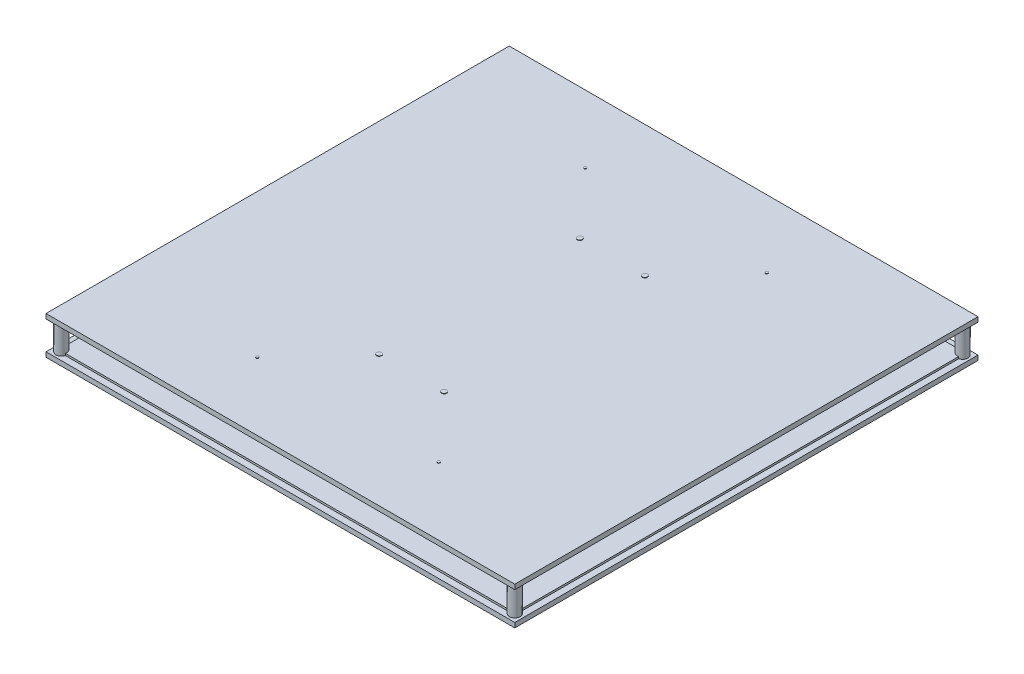
ISO-10303-21;
HEADER;
FILE_DESCRIPTION(('STEP AP214'),'2;1');
FILE_NAME('part.step','',(''),(''),'','','');
FILE_SCHEMA(('AUTOMOTIVE_DESIGN { 1 0 10303 214 1 1 1 1 }'));
ENDSEC;
DATA;
#1=APPLICATION_CONTEXT('core data for automotive mechanical design processes');
#2=APPLICATION_PROTOCOL_DEFINITION('international standard','automotive_design',2000,#1);
#3=PRODUCT_CONTEXT('',#1,'mechanical');
#4=PRODUCT('Part','Part','',(#3));
#5=PRODUCT_RELATED_PRODUCT_CATEGORY('part','',(#4));
#6=PRODUCT_DEFINITION_FORMATION('','',#4);
#7=PRODUCT_DEFINITION_CONTEXT('part definition',#1,'design');
#8=PRODUCT_DEFINITION('design','',#6,#7);
#9=PRODUCT_DEFINITION_SHAPE('','',#8);
#10=(LENGTH_UNIT() NAMED_UNIT(*) SI_UNIT(.MILLI.,.METRE.));
#11=(NAMED_UNIT(*) PLANE_ANGLE_UNIT() SI_UNIT($,.RADIAN.));
#12=(NAMED_UNIT(*) SI_UNIT($,.STERADIAN.) SOLID_ANGLE_UNIT());
#13=UNCERTAINTY_MEASURE_WITH_UNIT(LENGTH_MEASURE(1.E-05),#10,'distance_accuracy_value','');
#14=(GEOMETRIC_REPRESENTATION_CONTEXT(3) GLOBAL_UNCERTAINTY_ASSIGNED_CONTEXT((#13)) GLOBAL_UNIT_ASSIGNED_CONTEXT((#10,
#11,#12)) REPRESENTATION_CONTEXT('',''));
#15=CARTESIAN_POINT('',(0.,0.,0.));
#16=DIRECTION('',(0.,0.,1.));
#17=DIRECTION('',(1.,0.,0.));
#18=AXIS2_PLACEMENT_3D('',#15,#16,#17);
#19=CARTESIAN_POINT('',(151.154277778757,4.445,149.310271544904));
#20=DIRECTION('',(0.,0.,1.));
#21=DIRECTION('',(1.,0.,0.));
#22=AXIS2_PLACEMENT_3D('',#19,#20,#21);
#23=PLANE('',#22);
#24=DIRECTION('',(0.,-1.,0.));
#25=VECTOR('',#24,1.);
#26=CARTESIAN_POINT('',(-146.860277327342,23.876,149.310271544904));
#27=LINE('',#26,#25);
#28=CARTESIAN_POINT('',(-146.860277327342,3.175,149.310271544904));
#29=VERTEX_POINT('',#28);
#30=CARTESIAN_POINT('',(-146.860277327342,4.445,149.310271544904));
#31=VERTEX_POINT('',#30);
#32=EDGE_CURVE('E65',#29,#31,#27,.F.);
#33=ORIENTED_EDGE('',*,*,#32,.F.);
#34=DIRECTION('',(-1.,0.,0.));
#35=VECTOR('',#34,1.);
#36=CARTESIAN_POINT('',(151.154277778757,3.175,149.310271544904));
#37=LINE('',#36,#35);
#38=CARTESIAN_POINT('',(146.860277327342,3.175,149.310271544904));
#39=VERTEX_POINT('',#38);
#40=EDGE_CURVE('E320',#39,#29,#37,.T.);
#41=ORIENTED_EDGE('',*,*,#40,.F.);
#42=DIRECTION('',(0.,-1.,0.));
#43=VECTOR('',#42,1.);
#44=CARTESIAN_POINT('',(146.860277327342,23.876,149.310271544904));
#45=LINE('',#44,#43);
#46=CARTESIAN_POINT('',(146.860277327342,4.445,149.310271544904));
#47=VERTEX_POINT('',#46);
#48=EDGE_CURVE('E190',#39,#47,#45,.F.);
#49=ORIENTED_EDGE('',*,*,#48,.T.);
#50=DIRECTION('',(-1.,0.,0.));
#51=VECTOR('',#50,1.);
#52=CARTESIAN_POINT('',(151.154277778757,4.445,149.310271544904));
#53=LINE('',#52,#51);
#54=EDGE_CURVE('E169',#47,#31,#53,.T.);
#55=ORIENTED_EDGE('',*,*,#54,.T.);
#56=EDGE_LOOP('',(#33,#41,#49,#55));
#57=FACE_BOUND('',#56,.T.);
#58=ADVANCED_FACE('F42',(#57),#23,.T.);
#59=CARTESIAN_POINT('',(151.154277778757,4.445,-149.310271544904));
#60=DIRECTION('',(1.,0.,0.));
#61=DIRECTION('',(0.,0.,-1.));
#62=AXIS2_PLACEMENT_3D('',#59,#60,#61);
#63=PLANE('',#62);
#64=DIRECTION('',(0.,0.,1.));
#65=VECTOR('',#64,1.);
#66=CARTESIAN_POINT('',(151.154277778757,4.445,-149.310271544904));
#67=LINE('',#66,#65);
#68=CARTESIAN_POINT('',(151.154277778757,4.445,-145.016271093489));
#69=VERTEX_POINT('',#68);
#70=CARTESIAN_POINT('',(151.154277778757,4.445,145.016271093489));
#71=VERTEX_POINT('',#70);
#72=EDGE_CURVE('E324',#69,#71,#67,.T.);
#73=ORIENTED_EDGE('',*,*,#72,.T.);
#74=DIRECTION('',(0.,-1.,0.));
#75=VECTOR('',#74,1.);
#76=CARTESIAN_POINT('',(151.154277778757,23.876,145.016271093489));
#77=LINE('',#76,#75);
#78=CARTESIAN_POINT('',(151.154277778757,3.175,145.016271093489));
#79=VERTEX_POINT('',#78);
#80=EDGE_CURVE('E187',#71,#79,#77,.T.);
#81=ORIENTED_EDGE('',*,*,#80,.T.);
#82=DIRECTION('',(0.,0.,1.));
#83=VECTOR('',#82,1.);
#84=CARTESIAN_POINT('',(151.154277778757,3.175,-149.310271544904));
#85=LINE('',#84,#83);
#86=CARTESIAN_POINT('',(151.154277778757,3.175,-145.016271093489));
#87=VERTEX_POINT('',#86);
#88=EDGE_CURVE('E321',#87,#79,#85,.T.);
#89=ORIENTED_EDGE('',*,*,#88,.F.);
#90=DIRECTION('',(0.,-1.,0.));
#91=VECTOR('',#90,1.);
#92=CARTESIAN_POINT('',(151.154277778757,23.876,-145.016271093489));
#93=LINE('',#92,#91);
#94=EDGE_CURVE('E199',#69,#87,#93,.T.);
#95=ORIENTED_EDGE('',*,*,#94,.F.);
#96=EDGE_LOOP('',(#73,#81,#89,#95));
#97=FACE_BOUND('',#96,.T.);
#98=ADVANCED_FACE('F387',(#97),#63,.T.);
#99=CARTESIAN_POINT('',(151.154277778757,4.445,-149.310271544904));
#100=DIRECTION('',(0.,0.,1.));
#101=DIRECTION('',(1.,0.,0.));
#102=AXIS2_PLACEMENT_3D('',#99,#100,#101);
#103=PLANE('',#102);
#104=DIRECTION('',(-1.,0.,0.));
#105=VECTOR('',#104,1.);
#106=CARTESIAN_POINT('',(151.154277778757,4.445,-149.310271544904));
#107=LINE('',#106,#105);
#108=CARTESIAN_POINT('',(146.860277327342,4.445,-149.310271544904));
#109=VERTEX_POINT('',#108);
#110=CARTESIAN_POINT('',(-146.860277327342,4.445,-149.310271544904));
#111=VERTEX_POINT('',#110);
#112=EDGE_CURVE('E168',#109,#111,#107,.T.);
#113=ORIENTED_EDGE('',*,*,#112,.F.);
#114=DIRECTION('',(0.,-1.,0.));
#115=VECTOR('',#114,1.);
#116=CARTESIAN_POINT('',(146.860277327342,23.876,-149.310271544904));
#117=LINE('',#116,#115);
#118=CARTESIAN_POINT('',(146.860277327342,3.175,-149.310271544904));
#119=VERTEX_POINT('',#118);
#120=EDGE_CURVE('E205',#109,#119,#117,.T.);
#121=ORIENTED_EDGE('',*,*,#120,.T.);
#122=DIRECTION('',(-1.,0.,0.));
#123=VECTOR('',#122,1.);
#124=CARTESIAN_POINT('',(151.154277778757,3.175,-149.310271544904));
#125=LINE('',#124,#123);
#126=CARTESIAN_POINT('',(-146.860277327342,3.175,-149.310271544904));
#127=VERTEX_POINT('',#126);
#128=EDGE_CURVE('E330',#119,#127,#125,.T.);
#129=ORIENTED_EDGE('',*,*,#128,.T.);
#130=DIRECTION('',(0.,-1.,0.));
#131=VECTOR('',#130,1.);
#132=CARTESIAN_POINT('',(-146.860277327342,23.876,-149.310271544904));
#133=LINE('',#132,#131);
#134=EDGE_CURVE('E314',#111,#127,#133,.T.);
#135=ORIENTED_EDGE('',*,*,#134,.F.);
#136=EDGE_LOOP('',(#113,#121,#129,#135));
#137=FACE_BOUND('',#136,.T.);
#138=ADVANCED_FACE('F393',(#137),#103,.F.);
#139=CARTESIAN_POINT('',(-151.154277778757,4.445,-149.310271544904));
#140=DIRECTION('',(1.,0.,0.));
#141=DIRECTION('',(0.,0.,-1.));
#142=AXIS2_PLACEMENT_3D('',#139,#140,#141);
#143=PLANE('',#142);
#144=DIRECTION('',(0.,0.,1.));
#145=VECTOR('',#144,1.);
#146=CARTESIAN_POINT('',(-151.154277778757,3.175,-149.310271544904));
#147=LINE('',#146,#145);
#148=CARTESIAN_POINT('',(-151.154277778757,3.175,-145.016271093489));
#149=VERTEX_POINT('',#148);
#150=CARTESIAN_POINT('',(-151.154277778757,3.175,145.016271093489));
#151=VERTEX_POINT('',#150);
#152=EDGE_CURVE('E174',#149,#151,#147,.T.);
#153=ORIENTED_EDGE('',*,*,#152,.T.);
#154=DIRECTION('',(0.,-1.,0.));
#155=VECTOR('',#154,1.);
#156=CARTESIAN_POINT('',(-151.154277778757,23.876,145.016271093489));
#157=LINE('',#156,#155);
#158=CARTESIAN_POINT('',(-151.154277778757,4.445,145.016271093489));
#159=VERTEX_POINT('',#158);
#160=EDGE_CURVE('E172',#151,#159,#157,.F.);
#161=ORIENTED_EDGE('',*,*,#160,.T.);
#162=DIRECTION('',(0.,0.,1.));
#163=VECTOR('',#162,1.);
#164=CARTESIAN_POINT('',(-151.154277778757,4.445,-149.310271544904));
#165=LINE('',#164,#163);
#166=CARTESIAN_POINT('',(-151.154277778757,4.445,-145.016271093489));
#167=VERTEX_POINT('',#166);
#168=EDGE_CURVE('E158',#167,#159,#165,.T.);
#169=ORIENTED_EDGE('',*,*,#168,.F.);
#170=DIRECTION('',(0.,-1.,0.));
#171=VECTOR('',#170,1.);
#172=CARTESIAN_POINT('',(-151.154277778757,23.876,-145.016271093489));
#173=LINE('',#172,#171);
#174=EDGE_CURVE('E312',#149,#167,#173,.F.);
#175=ORIENTED_EDGE('',*,*,#174,.F.);
#176=EDGE_LOOP('',(#153,#161,#169,#175));
#177=FACE_BOUND('',#176,.T.);
#178=ADVANCED_FACE('F173',(#177),#143,.F.);
#179=CARTESIAN_POINT('',(0.,3.175,0.));
#180=DIRECTION('',(0.,1.,0.));
#181=DIRECTION('',(0.,0.,1.));
#182=AXIS2_PLACEMENT_3D('',#179,#180,#181);
#183=PLANE('',#182);
#184=CARTESIAN_POINT('',(-150.316077778757,3.175,148.472071544904));
#185=DIRECTION('',(0.,1.,0.));
#186=DIRECTION('',(0.,0.,1.));
#187=AXIS2_PLACEMENT_3D('',#184,#185,#186);
#188=CIRCLE('',#187,3.55600000000001);
#189=EDGE_CURVE('E57',#151,#29,#188,.T.);
#190=ORIENTED_EDGE('',*,*,#189,.F.);
#191=ORIENTED_EDGE('',*,*,#152,.F.);
#192=CARTESIAN_POINT('',(-150.316077778757,3.175,-148.472071544904));
#193=DIRECTION('',(0.,1.,0.));
#194=DIRECTION('',(0.,0.,1.));
#195=AXIS2_PLACEMENT_3D('',#192,#193,#194);
#196=CIRCLE('',#195,3.55600000000001);
#197=EDGE_CURVE('E317',#149,#127,#196,.F.);
#198=ORIENTED_EDGE('',*,*,#197,.T.);
#199=ORIENTED_EDGE('',*,*,#128,.F.);
#200=CARTESIAN_POINT('',(150.316077778757,3.175,-148.472071544904));
#201=DIRECTION('',(0.,1.,0.));
#202=DIRECTION('',(0.,0.,1.));
#203=AXIS2_PLACEMENT_3D('',#200,#201,#202);
#204=CIRCLE('',#203,3.55600000000001);
#205=EDGE_CURVE('E202',#87,#119,#204,.T.);
#206=ORIENTED_EDGE('',*,*,#205,.F.);
#207=ORIENTED_EDGE('',*,*,#88,.T.);
#208=CARTESIAN_POINT('',(150.316077778757,3.175,148.472071544904));
#209=DIRECTION('',(0.,1.,0.));
#210=DIRECTION('',(0.,0.,1.));
#211=AXIS2_PLACEMENT_3D('',#208,#209,#210);
#212=CIRCLE('',#211,3.55600000000001);
#213=EDGE_CURVE('E193',#79,#39,#212,.F.);
#214=ORIENTED_EDGE('',*,*,#213,.T.);
#215=ORIENTED_EDGE('',*,*,#40,.T.);
#216=EDGE_LOOP('',(#190,#191,#198,#199,#206,#207,#214,#215));
#217=FACE_BOUND('',#216,.T.);
#218=DIRECTION('',(1.,0.,0.));
#219=VECTOR('',#218,1.);
#220=CARTESIAN_POINT('',(-155.396077778757,3.175,-153.552071544904));
#221=LINE('',#220,#219);
#222=CARTESIAN_POINT('',(-155.396077778757,3.175,-153.552071544904));
#223=VERTEX_POINT('',#222);
#224=CARTESIAN_POINT('',(155.396077778757,3.175,-153.552071544904));
#225=VERTEX_POINT('',#224);
#226=EDGE_CURVE('E334',#223,#225,#221,.T.);
#227=ORIENTED_EDGE('',*,*,#226,.F.);
#228=DIRECTION('',(0.,0.,-1.));
#229=VECTOR('',#228,1.);
#230=CARTESIAN_POINT('',(-155.396077778757,3.175,153.552071544904));
#231=LINE('',#230,#229);
#232=CARTESIAN_POINT('',(-155.396077778757,3.175,153.552071544904));
#233=VERTEX_POINT('',#232);
#234=EDGE_CURVE('E342',#233,#223,#231,.T.);
#235=ORIENTED_EDGE('',*,*,#234,.F.);
#236=DIRECTION('',(1.,0.,0.));
#237=VECTOR('',#236,1.);
#238=CARTESIAN_POINT('',(-155.396077778757,3.175,153.552071544904));
#239=LINE('',#238,#237);
#240=CARTESIAN_POINT('',(155.396077778757,3.175,153.552071544904));
#241=VERTEX_POINT('',#240);
#242=EDGE_CURVE('E340',#233,#241,#239,.T.);
#243=ORIENTED_EDGE('',*,*,#242,.T.);
#244=DIRECTION('',(0.,0.,-1.));
#245=VECTOR('',#244,1.);
#246=CARTESIAN_POINT('',(155.396077778757,3.175,153.552071544904));
#247=LINE('',#246,#245);
#248=EDGE_CURVE('E337',#241,#225,#247,.T.);
#249=ORIENTED_EDGE('',*,*,#248,.T.);
#250=EDGE_LOOP('',(#227,#235,#243,#249));
#251=FACE_BOUND('',#250,.T.);
#252=ADVANCED_FACE('F399',(#217,#251),#183,.T.);
#253=CARTESIAN_POINT('',(-155.396077778757,3.175,-153.552071544904));
#254=DIRECTION('',(0.,0.,-1.));
#255=DIRECTION('',(-1.,0.,0.));
#256=AXIS2_PLACEMENT_3D('',#253,#254,#255);
#257=PLANE('',#256);
#258=DIRECTION('',(1.,0.,0.));
#259=VECTOR('',#258,1.);
#260=CARTESIAN_POINT('',(-155.396077778757,0.,-153.552071544904));
#261=LINE('',#260,#259);
#262=CARTESIAN_POINT('',(-155.396077778757,0.,-153.552071544904));
#263=VERTEX_POINT('',#262);
#264=CARTESIAN_POINT('',(155.396077778757,0.,-153.552071544904));
#265=VERTEX_POINT('',#264);
#266=EDGE_CURVE('E327',#263,#265,#261,.T.);
#267=ORIENTED_EDGE('',*,*,#266,.F.);
#268=DIRECTION('',(0.,-1.,0.));
#269=VECTOR('',#268,1.);
#270=CARTESIAN_POINT('',(-155.396077778757,3.175,-153.552071544904));
#271=LINE('',#270,#269);
#272=EDGE_CURVE('E355',#223,#263,#271,.T.);
#273=ORIENTED_EDGE('',*,*,#272,.F.);
#274=ORIENTED_EDGE('',*,*,#226,.T.);
#275=DIRECTION('',(0.,-1.,0.));
#276=VECTOR('',#275,1.);
#277=CARTESIAN_POINT('',(155.396077778757,3.175,-153.552071544904));
#278=LINE('',#277,#276);
#279=EDGE_CURVE('E345',#225,#265,#278,.T.);
#280=ORIENTED_EDGE('',*,*,#279,.T.);
#281=EDGE_LOOP('',(#267,#273,#274,#280));
#282=FACE_BOUND('',#281,.T.);
#283=ADVANCED_FACE('F44',(#282),#257,.T.);
#284=CARTESIAN_POINT('',(-155.396077778757,3.175,153.552071544904));
#285=DIRECTION('',(-1.,0.,0.));
#286=DIRECTION('',(0.,0.,1.));
#287=AXIS2_PLACEMENT_3D('',#284,#285,#286);
#288=PLANE('',#287);
#289=DIRECTION('',(0.,0.,-1.));
#290=VECTOR('',#289,1.);
#291=CARTESIAN_POINT('',(-155.396077778757,0.,153.552071544904));
#292=LINE('',#291,#290);
#293=CARTESIAN_POINT('',(-155.396077778757,0.,153.552071544904));
#294=VERTEX_POINT('',#293);
#295=EDGE_CURVE('E338',#294,#263,#292,.T.);
#296=ORIENTED_EDGE('',*,*,#295,.F.);
#297=DIRECTION('',(0.,-1.,0.));
#298=VECTOR('',#297,1.);
#299=CARTESIAN_POINT('',(-155.396077778757,3.175,153.552071544904));
#300=LINE('',#299,#298);
#301=EDGE_CURVE('E357',#233,#294,#300,.T.);
#302=ORIENTED_EDGE('',*,*,#301,.F.);
#303=ORIENTED_EDGE('',*,*,#234,.T.);
#304=ORIENTED_EDGE('',*,*,#272,.T.);
#305=EDGE_LOOP('',(#296,#302,#303,#304));
#306=FACE_BOUND('',#305,.T.);
#307=ADVANCED_FACE('F407',(#306),#288,.T.);
#308=CARTESIAN_POINT('',(-155.396077778757,3.175,153.552071544904));
#309=DIRECTION('',(0.,0.,-1.));
#310=DIRECTION('',(-1.,0.,0.));
#311=AXIS2_PLACEMENT_3D('',#308,#309,#310);
#312=PLANE('',#311);
#313=DIRECTION('',(1.,0.,0.));
#314=VECTOR('',#313,1.);
#315=CARTESIAN_POINT('',(-155.396077778757,0.,153.552071544904));
#316=LINE('',#315,#314);
#317=CARTESIAN_POINT('',(155.396077778757,0.,153.552071544904));
#318=VERTEX_POINT('',#317);
#319=EDGE_CURVE('E351',#294,#318,#316,.T.);
#320=ORIENTED_EDGE('',*,*,#319,.T.);
#321=DIRECTION('',(0.,-1.,0.));
#322=VECTOR('',#321,1.);
#323=CARTESIAN_POINT('',(155.396077778757,3.175,153.552071544904));
#324=LINE('',#323,#322);
#325=EDGE_CURVE('E359',#241,#318,#324,.T.);
#326=ORIENTED_EDGE('',*,*,#325,.F.);
#327=ORIENTED_EDGE('',*,*,#242,.F.);
#328=ORIENTED_EDGE('',*,*,#301,.T.);
#329=EDGE_LOOP('',(#320,#326,#327,#328));
#330=FACE_BOUND('',#329,.T.);
#331=ADVANCED_FACE('F410',(#330),#312,.F.);
#332=CARTESIAN_POINT('',(155.396077778757,3.175,153.552071544904));
#333=DIRECTION('',(-1.,0.,0.));
#334=DIRECTION('',(0.,0.,1.));
#335=AXIS2_PLACEMENT_3D('',#332,#333,#334);
#336=PLANE('',#335);
#337=DIRECTION('',(0.,0.,-1.));
#338=VECTOR('',#337,1.);
#339=CARTESIAN_POINT('',(155.396077778757,0.,153.552071544904));
#340=LINE('',#339,#338);
#341=EDGE_CURVE('E348',#318,#265,#340,.T.);
#342=ORIENTED_EDGE('',*,*,#341,.T.);
#343=ORIENTED_EDGE('',*,*,#279,.F.);
#344=ORIENTED_EDGE('',*,*,#248,.F.);
#345=ORIENTED_EDGE('',*,*,#325,.T.);
#346=EDGE_LOOP('',(#342,#343,#344,#345));
#347=FACE_BOUND('',#346,.T.);
#348=ADVANCED_FACE('F405',(#347),#336,.F.);
#349=CARTESIAN_POINT('',(0.,0.,0.));
#350=DIRECTION('',(0.,1.,0.));
#351=DIRECTION('',(0.,0.,1.));
#352=AXIS2_PLACEMENT_3D('',#349,#350,#351);
#353=PLANE('',#352);
#354=ORIENTED_EDGE('',*,*,#266,.T.);
#355=ORIENTED_EDGE('',*,*,#341,.F.);
#356=ORIENTED_EDGE('',*,*,#319,.F.);
#357=ORIENTED_EDGE('',*,*,#295,.T.);
#358=EDGE_LOOP('',(#354,#355,#356,#357));
#359=FACE_BOUND('',#358,.T.);
#360=ADVANCED_FACE('F402',(#359),#353,.F.);
#361=CARTESIAN_POINT('',(0.,4.445,0.));
#362=DIRECTION('',(0.,1.,0.));
#363=DIRECTION('',(0.,0.,1.));
#364=AXIS2_PLACEMENT_3D('',#361,#362,#363);
#365=PLANE('',#364);
#366=CARTESIAN_POINT('',(-150.316077778757,4.445,148.472071544904));
#367=DIRECTION('',(0.,1.,0.));
#368=DIRECTION('',(0.,0.,1.));
#369=AXIS2_PLACEMENT_3D('',#366,#367,#368);
#370=CIRCLE('',#369,3.55600000000001);
#371=EDGE_CURVE('E163',#31,#159,#370,.T.);
#372=ORIENTED_EDGE('',*,*,#371,.F.);
#373=ORIENTED_EDGE('',*,*,#54,.F.);
#374=CARTESIAN_POINT('',(150.316077778757,4.445,148.472071544904));
#375=DIRECTION('',(0.,1.,0.));
#376=DIRECTION('',(0.,0.,1.));
#377=AXIS2_PLACEMENT_3D('',#374,#375,#376);
#378=CIRCLE('',#377,3.55600000000001);
#379=EDGE_CURVE('E184',#47,#71,#378,.F.);
#380=ORIENTED_EDGE('',*,*,#379,.T.);
#381=ORIENTED_EDGE('',*,*,#72,.F.);
#382=CARTESIAN_POINT('',(150.316077778757,4.445,-148.472071544904));
#383=DIRECTION('',(0.,1.,0.));
#384=DIRECTION('',(0.,0.,1.));
#385=AXIS2_PLACEMENT_3D('',#382,#383,#384);
#386=CIRCLE('',#385,3.55600000000001);
#387=EDGE_CURVE('E196',#109,#69,#386,.T.);
#388=ORIENTED_EDGE('',*,*,#387,.F.);
#389=ORIENTED_EDGE('',*,*,#112,.T.);
#390=CARTESIAN_POINT('',(-150.316077778757,4.445,-148.472071544904));
#391=DIRECTION('',(0.,1.,0.));
#392=DIRECTION('',(0.,0.,1.));
#393=AXIS2_PLACEMENT_3D('',#390,#391,#392);
#394=CIRCLE('',#393,3.55600000000001);
#395=EDGE_CURVE('E165',#111,#167,#394,.F.);
#396=ORIENTED_EDGE('',*,*,#395,.T.);
#397=ORIENTED_EDGE('',*,*,#168,.T.);
#398=EDGE_LOOP('',(#372,#373,#380,#381,#388,#389,#396,#397));
#399=FACE_BOUND('',#398,.T.);
#400=ADVANCED_FACE('F160',(#399),#365,.T.);
#401=CARTESIAN_POINT('',(-150.316077778757,23.876,-148.472071544904));
#402=DIRECTION('',(0.,-1.,0.));
#403=DIRECTION('',(0.,0.,-1.));
#404=AXIS2_PLACEMENT_3D('',#401,#402,#403);
#405=CYLINDRICAL_SURFACE('',#404,3.55600000000001);
#406=CARTESIAN_POINT('',(-150.316077778757,21.9964,-148.472071544904));
#407=DIRECTION('',(0.,-1.,0.));
#408=DIRECTION('',(0.,0.,-1.));
#409=AXIS2_PLACEMENT_3D('',#406,#407,#408);
#410=CIRCLE('',#409,3.55600000000001);
#411=CARTESIAN_POINT('',(-150.316077778757,21.9964,-152.028071544904));
#412=VERTEX_POINT('',#411);
#413=EDGE_CURVE('E311',#412,#412,#410,.T.);
#414=ORIENTED_EDGE('',*,*,#413,.T.);
#415=EDGE_LOOP('',(#414));
#416=FACE_BOUND('',#415,.T.);
#417=ORIENTED_EDGE('',*,*,#197,.F.);
#418=ORIENTED_EDGE('',*,*,#174,.T.);
#419=ORIENTED_EDGE('',*,*,#395,.F.);
#420=ORIENTED_EDGE('',*,*,#134,.T.);
#421=EDGE_LOOP('',(#417,#418,#419,#420));
#422=FACE_BOUND('',#421,.T.);
#423=ADVANCED_FACE('F464',(#416,#422),#405,.T.);
#424=CARTESIAN_POINT('',(0.,21.9964,0.));
#425=DIRECTION('',(0.,-1.,0.));
#426=DIRECTION('',(0.,0.,-1.));
#427=AXIS2_PLACEMENT_3D('',#424,#425,#426);
#428=PLANE('',#427);
#429=CARTESIAN_POINT('',(-150.316077778757,21.9964,148.472071544904));
#430=DIRECTION('',(0.,-1.,0.));
#431=DIRECTION('',(0.,0.,-1.));
#432=AXIS2_PLACEMENT_3D('',#429,#430,#431);
#433=CIRCLE('',#432,3.55600000000001);
#434=CARTESIAN_POINT('',(-150.316077778757,21.9964,144.916071544904));
#435=VERTEX_POINT('',#434);
#436=EDGE_CURVE('E13',#435,#435,#433,.T.);
#437=ORIENTED_EDGE('',*,*,#436,.F.);
#438=EDGE_LOOP('',(#437));
#439=FACE_BOUND('',#438,.T.);
#440=CARTESIAN_POINT('',(150.316077778757,21.9964,148.472071544904));
#441=DIRECTION('',(0.,-1.,0.));
#442=DIRECTION('',(0.,0.,-1.));
#443=AXIS2_PLACEMENT_3D('',#440,#441,#442);
#444=CIRCLE('',#443,3.55600000000001);
#445=CARTESIAN_POINT('',(150.316077778757,21.9964,144.916071544904));
#446=VERTEX_POINT('',#445);
#447=EDGE_CURVE('E183',#446,#446,#444,.F.);
#448=ORIENTED_EDGE('',*,*,#447,.T.);
#449=EDGE_LOOP('',(#448));
#450=FACE_BOUND('',#449,.T.);
#451=CARTESIAN_POINT('',(150.316077778757,21.9964,-148.472071544904));
#452=DIRECTION('',(0.,-1.,0.));
#453=DIRECTION('',(0.,0.,-1.));
#454=AXIS2_PLACEMENT_3D('',#451,#452,#453);
#455=CIRCLE('',#454,3.55600000000001);
#456=CARTESIAN_POINT('',(150.316077778757,21.9964,-152.028071544904));
#457=VERTEX_POINT('',#456);
#458=EDGE_CURVE('E50',#457,#457,#455,.T.);
#459=ORIENTED_EDGE('',*,*,#458,.F.);
#460=EDGE_LOOP('',(#459));
#461=FACE_BOUND('',#460,.T.);
#462=ORIENTED_EDGE('',*,*,#413,.F.);
#463=EDGE_LOOP('',(#462));
#464=FACE_BOUND('',#463,.T.);
#465=DIRECTION('',(-1.,0.,0.));
#466=VECTOR('',#465,1.);
#467=CARTESIAN_POINT('',(155.396077778757,21.9964,-153.552071544904));
#468=LINE('',#467,#466);
#469=CARTESIAN_POINT('',(155.396077778757,21.9964,-153.552071544904));
#470=VERTEX_POINT('',#469);
#471=CARTESIAN_POINT('',(-155.396077778757,21.9964,-153.552071544904));
#472=VERTEX_POINT('',#471);
#473=EDGE_CURVE('E260',#470,#472,#468,.T.);
#474=ORIENTED_EDGE('',*,*,#473,.F.);
#475=DIRECTION('',(0.,0.,-1.));
#476=VECTOR('',#475,1.);
#477=CARTESIAN_POINT('',(155.396077778757,21.9964,153.552071544904));
#478=LINE('',#477,#476);
#479=CARTESIAN_POINT('',(155.396077778757,21.9964,153.552071544904));
#480=VERTEX_POINT('',#479);
#481=EDGE_CURVE('E243',#480,#470,#478,.T.);
#482=ORIENTED_EDGE('',*,*,#481,.F.);
#483=DIRECTION('',(1.,0.,0.));
#484=VECTOR('',#483,1.);
#485=CARTESIAN_POINT('',(-155.396077778757,21.9964,153.552071544904));
#486=LINE('',#485,#484);
#487=CARTESIAN_POINT('',(-155.396077778757,21.9964,153.552071544904));
#488=VERTEX_POINT('',#487);
#489=EDGE_CURVE('E247',#488,#480,#486,.T.);
#490=ORIENTED_EDGE('',*,*,#489,.F.);
#491=DIRECTION('',(0.,0.,1.));
#492=VECTOR('',#491,1.);
#493=CARTESIAN_POINT('',(-155.396077778757,21.9964,-153.552071544904));
#494=LINE('',#493,#492);
#495=EDGE_CURVE('E267',#472,#488,#494,.T.);
#496=ORIENTED_EDGE('',*,*,#495,.F.);
#497=EDGE_LOOP('',(#474,#482,#490,#496));
#498=FACE_BOUND('',#497,.T.);
#499=ADVANCED_FACE('F370',(#439,#450,#461,#464,#498),#428,.T.);
#500=CARTESIAN_POINT('',(0.,25.1714,0.));
#501=DIRECTION('',(0.,-1.,0.));
#502=DIRECTION('',(0.,0.,-1.));
#503=AXIS2_PLACEMENT_3D('',#500,#501,#502);
#504=PLANE('',#503);
#505=CARTESIAN_POINT('',(60.1460777787568,25.1714,108.716299119564));
#506=DIRECTION('',(0.,-1.,0.));
#507=DIRECTION('',(0.,0.,-1.));
#508=AXIS2_PLACEMENT_3D('',#505,#506,#507);
#509=CIRCLE('',#508,0.911045745730185);
#510=CARTESIAN_POINT('',(60.1460777787568,25.1714,107.805253373834));
#511=VERTEX_POINT('',#510);
#512=EDGE_CURVE('E208',#511,#511,#509,.T.);
#513=ORIENTED_EDGE('',*,*,#512,.T.);
#514=EDGE_LOOP('',(#513));
#515=FACE_BOUND('',#514,.T.);
#516=CARTESIAN_POINT('',(21.5380777787568,25.1714,66.5522991195644));
#517=DIRECTION('',(0.,-1.,0.));
#518=DIRECTION('',(0.,0.,-1.));
#519=AXIS2_PLACEMENT_3D('',#516,#517,#518);
#520=CIRCLE('',#519,1.6837403917797);
#521=CARTESIAN_POINT('',(21.5380777787568,25.1714,64.8685587277847));
#522=VERTEX_POINT('',#521);
#523=EDGE_CURVE('E214',#522,#522,#520,.T.);
#524=ORIENTED_EDGE('',*,*,#523,.T.);
#525=EDGE_LOOP('',(#524));
#526=FACE_BOUND('',#525,.T.);
#527=CARTESIAN_POINT('',(60.1460777787568,25.1714,-108.716299119564));
#528=DIRECTION('',(0.,-1.,0.));
#529=DIRECTION('',(0.,0.,-1.));
#530=AXIS2_PLACEMENT_3D('',#527,#528,#529);
#531=CIRCLE('',#530,0.911045745730185);
#532=CARTESIAN_POINT('',(60.1460777787568,25.1714,-109.627344865295));
#533=VERTEX_POINT('',#532);
#534=EDGE_CURVE('E308',#533,#533,#531,.F.);
#535=ORIENTED_EDGE('',*,*,#534,.F.);
#536=EDGE_LOOP('',(#535));
#537=FACE_BOUND('',#536,.T.);
#538=CARTESIAN_POINT('',(21.5380777787568,25.1714,-66.5522991195644));
#539=DIRECTION('',(0.,-1.,0.));
#540=DIRECTION('',(0.,0.,-1.));
#541=AXIS2_PLACEMENT_3D('',#538,#539,#540);
#542=CIRCLE('',#541,1.6837403917797);
#543=CARTESIAN_POINT('',(21.5380777787568,25.1714,-68.2360395113441));
#544=VERTEX_POINT('',#543);
#545=EDGE_CURVE('E305',#544,#544,#542,.F.);
#546=ORIENTED_EDGE('',*,*,#545,.F.);
#547=EDGE_LOOP('',(#546));
#548=FACE_BOUND('',#547,.T.);
#549=CARTESIAN_POINT('',(-21.5380777787568,25.1714,-66.5522991195644));
#550=DIRECTION('',(0.,-1.,0.));
#551=DIRECTION('',(0.,0.,-1.));
#552=AXIS2_PLACEMENT_3D('',#549,#550,#551);
#553=CIRCLE('',#552,1.6837403917797);
#554=CARTESIAN_POINT('',(-21.5380777787568,25.1714,-68.2360395113441));
#555=VERTEX_POINT('',#554);
#556=EDGE_CURVE('E226',#555,#555,#553,.T.);
#557=ORIENTED_EDGE('',*,*,#556,.T.);
#558=EDGE_LOOP('',(#557));
#559=FACE_BOUND('',#558,.T.);
#560=CARTESIAN_POINT('',(-60.1460777787567,25.1714,-108.716299119564));
#561=DIRECTION('',(0.,-1.,0.));
#562=DIRECTION('',(0.,0.,-1.));
#563=AXIS2_PLACEMENT_3D('',#560,#561,#562);
#564=CIRCLE('',#563,0.911045745730185);
#565=CARTESIAN_POINT('',(-60.1460777787567,25.1714,-109.627344865295));
#566=VERTEX_POINT('',#565);
#567=EDGE_CURVE('E232',#566,#566,#564,.T.);
#568=ORIENTED_EDGE('',*,*,#567,.T.);
#569=EDGE_LOOP('',(#568));
#570=FACE_BOUND('',#569,.T.);
#571=CARTESIAN_POINT('',(-21.5380777787568,25.1714,66.5522991195644));
#572=DIRECTION('',(0.,-1.,0.));
#573=DIRECTION('',(0.,0.,-1.));
#574=AXIS2_PLACEMENT_3D('',#571,#572,#573);
#575=CIRCLE('',#574,1.6837403917797);
#576=CARTESIAN_POINT('',(-21.5380777787568,25.1714,64.8685587277847));
#577=VERTEX_POINT('',#576);
#578=EDGE_CURVE('E302',#577,#577,#575,.F.);
#579=ORIENTED_EDGE('',*,*,#578,.F.);
#580=EDGE_LOOP('',(#579));
#581=FACE_BOUND('',#580,.T.);
#582=CARTESIAN_POINT('',(-60.1460777787567,25.1714,108.716299119564));
#583=DIRECTION('',(0.,-1.,0.));
#584=DIRECTION('',(0.,0.,-1.));
#585=AXIS2_PLACEMENT_3D('',#582,#583,#584);
#586=CIRCLE('',#585,0.911045745730185);
#587=CARTESIAN_POINT('',(-60.1460777787567,25.1714,107.805253373834));
#588=VERTEX_POINT('',#587);
#589=EDGE_CURVE('E259',#588,#588,#586,.F.);
#590=ORIENTED_EDGE('',*,*,#589,.F.);
#591=EDGE_LOOP('',(#590));
#592=FACE_BOUND('',#591,.T.);
#593=DIRECTION('',(-1.,0.,0.));
#594=VECTOR('',#593,1.);
#595=CARTESIAN_POINT('',(155.396077778757,25.1714,-153.552071544904));
#596=LINE('',#595,#594);
#597=CARTESIAN_POINT('',(155.396077778757,25.1714,-153.552071544904));
#598=VERTEX_POINT('',#597);
#599=CARTESIAN_POINT('',(-155.396077778757,25.1714,-153.552071544904));
#600=VERTEX_POINT('',#599);
#601=EDGE_CURVE('E256',#598,#600,#596,.T.);
#602=ORIENTED_EDGE('',*,*,#601,.T.);
#603=DIRECTION('',(0.,0.,1.));
#604=VECTOR('',#603,1.);
#605=CARTESIAN_POINT('',(-155.396077778757,25.1714,-153.552071544904));
#606=LINE('',#605,#604);
#607=CARTESIAN_POINT('',(-155.396077778757,25.1714,153.552071544904));
#608=VERTEX_POINT('',#607);
#609=EDGE_CURVE('E266',#600,#608,#606,.T.);
#610=ORIENTED_EDGE('',*,*,#609,.T.);
#611=DIRECTION('',(1.,0.,0.));
#612=VECTOR('',#611,1.);
#613=CARTESIAN_POINT('',(-155.396077778757,25.1714,153.552071544904));
#614=LINE('',#613,#612);
#615=CARTESIAN_POINT('',(155.396077778757,25.1714,153.552071544904));
#616=VERTEX_POINT('',#615);
#617=EDGE_CURVE('E281',#608,#616,#614,.T.);
#618=ORIENTED_EDGE('',*,*,#617,.T.);
#619=DIRECTION('',(0.,0.,-1.));
#620=VECTOR('',#619,1.);
#621=CARTESIAN_POINT('',(155.396077778757,25.1714,153.552071544904));
#622=LINE('',#621,#620);
#623=EDGE_CURVE('E248',#616,#598,#622,.T.);
#624=ORIENTED_EDGE('',*,*,#623,.T.);
#625=EDGE_LOOP('',(#602,#610,#618,#624));
#626=FACE_BOUND('',#625,.T.);
#627=ADVANCED_FACE('F487',(#515,#526,#537,#548,#559,#570,#581,#592,#626),#504,.F.);
#628=CARTESIAN_POINT('',(155.396077778757,25.1714,153.552071544904));
#629=DIRECTION('',(-1.,0.,0.));
#630=DIRECTION('',(0.,0.,1.));
#631=AXIS2_PLACEMENT_3D('',#628,#629,#630);
#632=PLANE('',#631);
#633=ORIENTED_EDGE('',*,*,#481,.T.);
#634=DIRECTION('',(0.,-1.,0.));
#635=VECTOR('',#634,1.);
#636=CARTESIAN_POINT('',(155.396077778757,25.1714,-153.552071544904));
#637=LINE('',#636,#635);
#638=EDGE_CURVE('E244',#598,#470,#637,.T.);
#639=ORIENTED_EDGE('',*,*,#638,.F.);
#640=ORIENTED_EDGE('',*,*,#623,.F.);
#641=DIRECTION('',(0.,-1.,0.));
#642=VECTOR('',#641,1.);
#643=CARTESIAN_POINT('',(155.396077778757,25.1714,153.552071544904));
#644=LINE('',#643,#642);
#645=EDGE_CURVE('E253',#616,#480,#644,.T.);
#646=ORIENTED_EDGE('',*,*,#645,.T.);
#647=EDGE_LOOP('',(#633,#639,#640,#646));
#648=FACE_BOUND('',#647,.T.);
#649=ADVANCED_FACE('F499',(#648),#632,.F.);
#650=CARTESIAN_POINT('',(-155.396077778757,25.1714,153.552071544904));
#651=DIRECTION('',(0.,0.,-1.));
#652=DIRECTION('',(-1.,0.,0.));
#653=AXIS2_PLACEMENT_3D('',#650,#651,#652);
#654=PLANE('',#653);
#655=ORIENTED_EDGE('',*,*,#489,.T.);
#656=ORIENTED_EDGE('',*,*,#645,.F.);
#657=ORIENTED_EDGE('',*,*,#617,.F.);
#658=DIRECTION('',(0.,-1.,0.));
#659=VECTOR('',#658,1.);
#660=CARTESIAN_POINT('',(-155.396077778757,25.1714,153.552071544904));
#661=LINE('',#660,#659);
#662=EDGE_CURVE('E284',#608,#488,#661,.T.);
#663=ORIENTED_EDGE('',*,*,#662,.T.);
#664=EDGE_LOOP('',(#655,#656,#657,#663));
#665=FACE_BOUND('',#664,.T.);
#666=ADVANCED_FACE('F509',(#665),#654,.F.);
#667=CARTESIAN_POINT('',(-155.396077778757,25.1714,-153.552071544904));
#668=DIRECTION('',(1.,0.,0.));
#669=DIRECTION('',(0.,0.,-1.));
#670=AXIS2_PLACEMENT_3D('',#667,#668,#669);
#671=PLANE('',#670);
#672=ORIENTED_EDGE('',*,*,#495,.T.);
#673=ORIENTED_EDGE('',*,*,#662,.F.);
#674=ORIENTED_EDGE('',*,*,#609,.F.);
#675=DIRECTION('',(0.,-1.,0.));
#676=VECTOR('',#675,1.);
#677=CARTESIAN_POINT('',(-155.396077778757,25.1714,-153.552071544904));
#678=LINE('',#677,#676);
#679=EDGE_CURVE('E263',#600,#472,#678,.T.);
#680=ORIENTED_EDGE('',*,*,#679,.T.);
#681=EDGE_LOOP('',(#672,#673,#674,#680));
#682=FACE_BOUND('',#681,.T.);
#683=ADVANCED_FACE('F519',(#682),#671,.F.);
#684=CARTESIAN_POINT('',(155.396077778757,25.1714,-153.552071544904));
#685=DIRECTION('',(0.,0.,1.));
#686=DIRECTION('',(1.,0.,0.));
#687=AXIS2_PLACEMENT_3D('',#684,#685,#686);
#688=PLANE('',#687);
#689=ORIENTED_EDGE('',*,*,#473,.T.);
#690=ORIENTED_EDGE('',*,*,#679,.F.);
#691=ORIENTED_EDGE('',*,*,#601,.F.);
#692=ORIENTED_EDGE('',*,*,#638,.T.);
#693=EDGE_LOOP('',(#689,#690,#691,#692));
#694=FACE_BOUND('',#693,.T.);
#695=ADVANCED_FACE('F529',(#694),#688,.F.);
#696=CARTESIAN_POINT('',(-60.1460777787567,25.4254,108.716299119564));
#697=DIRECTION('',(0.,-1.,0.));
#698=DIRECTION('',(0.,0.,-1.));
#699=AXIS2_PLACEMENT_3D('',#696,#697,#698);
#700=CYLINDRICAL_SURFACE('',#699,0.911045745730185);
#701=CARTESIAN_POINT('',(-60.1460777787567,25.4254,108.716299119564));
#702=DIRECTION('',(0.,1.,0.));
#703=DIRECTION('',(0.,0.,1.));
#704=AXIS2_PLACEMENT_3D('',#701,#702,#703);
#705=CIRCLE('',#704,0.911045745730185);
#706=CARTESIAN_POINT('',(-60.1460777787567,25.4254,109.627344865295));
#707=VERTEX_POINT('',#706);
#708=EDGE_CURVE('E240',#707,#707,#705,.T.);
#709=ORIENTED_EDGE('',*,*,#708,.F.);
#710=EDGE_LOOP('',(#709));
#711=FACE_BOUND('',#710,.T.);
#712=ORIENTED_EDGE('',*,*,#589,.T.);
#713=EDGE_LOOP('',(#712));
#714=FACE_BOUND('',#713,.T.);
#715=ADVANCED_FACE('F490',(#711,#714),#700,.T.);
#716=CARTESIAN_POINT('',(0.,25.4254,0.));
#717=DIRECTION('',(0.,1.,0.));
#718=DIRECTION('',(0.,0.,1.));
#719=AXIS2_PLACEMENT_3D('',#716,#717,#718);
#720=PLANE('',#719);
#721=ORIENTED_EDGE('',*,*,#708,.T.);
#722=EDGE_LOOP('',(#721));
#723=FACE_BOUND('',#722,.T.);
#724=ADVANCED_FACE('F548',(#723),#720,.T.);
#725=CARTESIAN_POINT('',(-21.5380777787568,25.4254,66.5522991195644));
#726=DIRECTION('',(0.,-1.,0.));
#727=DIRECTION('',(0.,0.,-1.));
#728=AXIS2_PLACEMENT_3D('',#725,#726,#727);
#729=CYLINDRICAL_SURFACE('',#728,1.6837403917797);
#730=CARTESIAN_POINT('',(-21.5380777787568,25.4254,66.5522991195644));
#731=DIRECTION('',(0.,1.,0.));
#732=DIRECTION('',(0.,0.,1.));
#733=AXIS2_PLACEMENT_3D('',#730,#731,#732);
#734=CIRCLE('',#733,1.6837403917797);
#735=CARTESIAN_POINT('',(-21.5380777787568,25.4254,68.2360395113441));
#736=VERTEX_POINT('',#735);
#737=EDGE_CURVE('E235',#736,#736,#734,.T.);
#738=ORIENTED_EDGE('',*,*,#737,.F.);
#739=EDGE_LOOP('',(#738));
#740=FACE_BOUND('',#739,.T.);
#741=ORIENTED_EDGE('',*,*,#578,.T.);
#742=EDGE_LOOP('',(#741));
#743=FACE_BOUND('',#742,.T.);
#744=ADVANCED_FACE('F558',(#740,#743),#729,.T.);
#745=CARTESIAN_POINT('',(0.,25.4254,0.));
#746=DIRECTION('',(0.,1.,0.));
#747=DIRECTION('',(0.,0.,1.));
#748=AXIS2_PLACEMENT_3D('',#745,#746,#747);
#749=PLANE('',#748);
#750=ORIENTED_EDGE('',*,*,#737,.T.);
#751=EDGE_LOOP('',(#750));
#752=FACE_BOUND('',#751,.T.);
#753=ADVANCED_FACE('F568',(#752),#749,.T.);
#754=CARTESIAN_POINT('',(-60.1460777787567,25.4254,-108.716299119564));
#755=DIRECTION('',(0.,-1.,0.));
#756=DIRECTION('',(0.,0.,-1.));
#757=AXIS2_PLACEMENT_3D('',#754,#755,#756);
#758=CYLINDRICAL_SURFACE('',#757,0.911045745730185);
#759=CARTESIAN_POINT('',(-60.1460777787567,25.4254,-108.716299119564));
#760=DIRECTION('',(0.,-1.,0.));
#761=DIRECTION('',(0.,0.,-1.));
#762=AXIS2_PLACEMENT_3D('',#759,#760,#761);
#763=CIRCLE('',#762,0.911045745730185);
#764=CARTESIAN_POINT('',(-60.1460777787567,25.4254,-109.627344865295));
#765=VERTEX_POINT('',#764);
#766=EDGE_CURVE('E229',#765,#765,#763,.T.);
#767=ORIENTED_EDGE('',*,*,#766,.T.);
#768=EDGE_LOOP('',(#767));
#769=FACE_BOUND('',#768,.T.);
#770=ORIENTED_EDGE('',*,*,#567,.F.);
#771=EDGE_LOOP('',(#770));
#772=FACE_BOUND('',#771,.T.);
#773=ADVANCED_FACE('F578',(#769,#772),#758,.T.);
#774=CARTESIAN_POINT('',(-60.1460777787567,25.4254,-108.716299119564));
#775=DIRECTION('',(0.,-1.,0.));
#776=DIRECTION('',(0.,0.,-1.));
#777=AXIS2_PLACEMENT_3D('',#774,#775,#776);
#778=PLANE('',#777);
#779=ORIENTED_EDGE('',*,*,#766,.F.);
#780=EDGE_LOOP('',(#779));
#781=FACE_BOUND('',#780,.T.);
#782=ADVANCED_FACE('F587',(#781),#778,.F.);
#783=CARTESIAN_POINT('',(-21.5380777787568,25.4254,-66.5522991195644));
#784=DIRECTION('',(0.,-1.,0.));
#785=DIRECTION('',(0.,0.,-1.));
#786=AXIS2_PLACEMENT_3D('',#783,#784,#785);
#787=CYLINDRICAL_SURFACE('',#786,1.6837403917797);
#788=CARTESIAN_POINT('',(-21.5380777787568,25.4254,-66.5522991195644));
#789=DIRECTION('',(0.,-1.,0.));
#790=DIRECTION('',(0.,0.,-1.));
#791=AXIS2_PLACEMENT_3D('',#788,#789,#790);
#792=CIRCLE('',#791,1.6837403917797);
#793=CARTESIAN_POINT('',(-21.5380777787568,25.4254,-68.2360395113441));
#794=VERTEX_POINT('',#793);
#795=EDGE_CURVE('E225',#794,#794,#792,.T.);
#796=ORIENTED_EDGE('',*,*,#795,.T.);
#797=EDGE_LOOP('',(#796));
#798=FACE_BOUND('',#797,.T.);
#799=ORIENTED_EDGE('',*,*,#556,.F.);
#800=EDGE_LOOP('',(#799));
#801=FACE_BOUND('',#800,.T.);
#802=ADVANCED_FACE('F596',(#798,#801),#787,.T.);
#803=CARTESIAN_POINT('',(-21.5380777787568,25.4254,-66.5522991195644));
#804=DIRECTION('',(0.,-1.,0.));
#805=DIRECTION('',(0.,0.,-1.));
#806=AXIS2_PLACEMENT_3D('',#803,#804,#805);
#807=PLANE('',#806);
#808=ORIENTED_EDGE('',*,*,#795,.F.);
#809=EDGE_LOOP('',(#808));
#810=FACE_BOUND('',#809,.T.);
#811=ADVANCED_FACE('F605',(#810),#807,.F.);
#812=CARTESIAN_POINT('',(21.5380777787568,25.4254,-66.5522991195644));
#813=DIRECTION('',(0.,-1.,0.));
#814=DIRECTION('',(0.,0.,-1.));
#815=AXIS2_PLACEMENT_3D('',#812,#813,#814);
#816=CYLINDRICAL_SURFACE('',#815,1.6837403917797);
#817=CARTESIAN_POINT('',(21.5380777787568,25.4254,-66.5522991195644));
#818=DIRECTION('',(0.,1.,0.));
#819=DIRECTION('',(0.,0.,1.));
#820=AXIS2_PLACEMENT_3D('',#817,#818,#819);
#821=CIRCLE('',#820,1.6837403917797);
#822=CARTESIAN_POINT('',(21.5380777787568,25.4254,-64.8685587277847));
#823=VERTEX_POINT('',#822);
#824=EDGE_CURVE('E222',#823,#823,#821,.T.);
#825=ORIENTED_EDGE('',*,*,#824,.F.);
#826=EDGE_LOOP('',(#825));
#827=FACE_BOUND('',#826,.T.);
#828=ORIENTED_EDGE('',*,*,#545,.T.);
#829=EDGE_LOOP('',(#828));
#830=FACE_BOUND('',#829,.T.);
#831=ADVANCED_FACE('F614',(#827,#830),#816,.T.);
#832=CARTESIAN_POINT('',(21.5380777787568,25.4254,-66.5522991195644));
#833=DIRECTION('',(0.,1.,0.));
#834=DIRECTION('',(0.,0.,1.));
#835=AXIS2_PLACEMENT_3D('',#832,#833,#834);
#836=PLANE('',#835);
#837=ORIENTED_EDGE('',*,*,#824,.T.);
#838=EDGE_LOOP('',(#837));
#839=FACE_BOUND('',#838,.T.);
#840=ADVANCED_FACE('F623',(#839),#836,.T.);
#841=CARTESIAN_POINT('',(60.1460777787568,25.4254,-108.716299119564));
#842=DIRECTION('',(0.,-1.,0.));
#843=DIRECTION('',(0.,0.,-1.));
#844=AXIS2_PLACEMENT_3D('',#841,#842,#843);
#845=CYLINDRICAL_SURFACE('',#844,0.911045745730185);
#846=CARTESIAN_POINT('',(60.1460777787568,25.4254,-108.716299119564));
#847=DIRECTION('',(0.,1.,0.));
#848=DIRECTION('',(0.,0.,1.));
#849=AXIS2_PLACEMENT_3D('',#846,#847,#848);
#850=CIRCLE('',#849,0.911045745730185);
#851=CARTESIAN_POINT('',(60.1460777787568,25.4254,-107.805253373834));
#852=VERTEX_POINT('',#851);
#853=EDGE_CURVE('E217',#852,#852,#850,.T.);
#854=ORIENTED_EDGE('',*,*,#853,.F.);
#855=EDGE_LOOP('',(#854));
#856=FACE_BOUND('',#855,.T.);
#857=ORIENTED_EDGE('',*,*,#534,.T.);
#858=EDGE_LOOP('',(#857));
#859=FACE_BOUND('',#858,.T.);
#860=ADVANCED_FACE('F632',(#856,#859),#845,.T.);
#861=CARTESIAN_POINT('',(60.1460777787568,25.4254,-108.716299119564));
#862=DIRECTION('',(0.,1.,0.));
#863=DIRECTION('',(0.,0.,1.));
#864=AXIS2_PLACEMENT_3D('',#861,#862,#863);
#865=PLANE('',#864);
#866=ORIENTED_EDGE('',*,*,#853,.T.);
#867=EDGE_LOOP('',(#866));
#868=FACE_BOUND('',#867,.T.);
#869=ADVANCED_FACE('F641',(#868),#865,.T.);
#870=CARTESIAN_POINT('',(21.5380777787568,25.4254,66.5522991195644));
#871=DIRECTION('',(0.,-1.,0.));
#872=DIRECTION('',(0.,0.,-1.));
#873=AXIS2_PLACEMENT_3D('',#870,#871,#872);
#874=CYLINDRICAL_SURFACE('',#873,1.6837403917797);
#875=CARTESIAN_POINT('',(21.5380777787568,25.4254,66.5522991195644));
#876=DIRECTION('',(0.,-1.,0.));
#877=DIRECTION('',(0.,0.,-1.));
#878=AXIS2_PLACEMENT_3D('',#875,#876,#877);
#879=CIRCLE('',#878,1.6837403917797);
#880=CARTESIAN_POINT('',(21.5380777787568,25.4254,64.8685587277847));
#881=VERTEX_POINT('',#880);
#882=EDGE_CURVE('E211',#881,#881,#879,.T.);
#883=ORIENTED_EDGE('',*,*,#882,.T.);
#884=EDGE_LOOP('',(#883));
#885=FACE_BOUND('',#884,.T.);
#886=ORIENTED_EDGE('',*,*,#523,.F.);
#887=EDGE_LOOP('',(#886));
#888=FACE_BOUND('',#887,.T.);
#889=ADVANCED_FACE('F650',(#885,#888),#874,.T.);
#890=CARTESIAN_POINT('',(21.5380777787568,25.4254,66.5522991195644));
#891=DIRECTION('',(0.,-1.,0.));
#892=DIRECTION('',(0.,0.,-1.));
#893=AXIS2_PLACEMENT_3D('',#890,#891,#892);
#894=PLANE('',#893);
#895=ORIENTED_EDGE('',*,*,#882,.F.);
#896=EDGE_LOOP('',(#895));
#897=FACE_BOUND('',#896,.T.);
#898=ADVANCED_FACE('F659',(#897),#894,.F.);
#899=CARTESIAN_POINT('',(60.1460777787568,25.4254,108.716299119564));
#900=DIRECTION('',(0.,-1.,0.));
#901=DIRECTION('',(0.,0.,-1.));
#902=AXIS2_PLACEMENT_3D('',#899,#900,#901);
#903=CYLINDRICAL_SURFACE('',#902,0.911045745730185);
#904=CARTESIAN_POINT('',(60.1460777787568,25.4254,108.716299119564));
#905=DIRECTION('',(0.,-1.,0.));
#906=DIRECTION('',(0.,0.,-1.));
#907=AXIS2_PLACEMENT_3D('',#904,#905,#906);
#908=CIRCLE('',#907,0.911045745730185);
#909=CARTESIAN_POINT('',(60.1460777787568,25.4254,107.805253373834));
#910=VERTEX_POINT('',#909);
#911=EDGE_CURVE('E207',#910,#910,#908,.T.);
#912=ORIENTED_EDGE('',*,*,#911,.T.);
#913=EDGE_LOOP('',(#912));
#914=FACE_BOUND('',#913,.T.);
#915=ORIENTED_EDGE('',*,*,#512,.F.);
#916=EDGE_LOOP('',(#915));
#917=FACE_BOUND('',#916,.T.);
#918=ADVANCED_FACE('F668',(#914,#917),#903,.T.);
#919=CARTESIAN_POINT('',(60.1460777787568,25.4254,108.716299119564));
#920=DIRECTION('',(0.,-1.,0.));
#921=DIRECTION('',(0.,0.,-1.));
#922=AXIS2_PLACEMENT_3D('',#919,#920,#921);
#923=PLANE('',#922);
#924=ORIENTED_EDGE('',*,*,#911,.F.);
#925=EDGE_LOOP('',(#924));
#926=FACE_BOUND('',#925,.T.);
#927=ADVANCED_FACE('F383',(#926),#923,.F.);
#928=CARTESIAN_POINT('',(150.316077778757,23.876,-148.472071544904));
#929=DIRECTION('',(0.,-1.,0.));
#930=DIRECTION('',(0.,0.,-1.));
#931=AXIS2_PLACEMENT_3D('',#928,#929,#930);
#932=CYLINDRICAL_SURFACE('',#931,3.55600000000001);
#933=ORIENTED_EDGE('',*,*,#458,.T.);
#934=EDGE_LOOP('',(#933));
#935=FACE_BOUND('',#934,.T.);
#936=ORIENTED_EDGE('',*,*,#120,.F.);
#937=ORIENTED_EDGE('',*,*,#387,.T.);
#938=ORIENTED_EDGE('',*,*,#94,.T.);
#939=ORIENTED_EDGE('',*,*,#205,.T.);
#940=EDGE_LOOP('',(#936,#937,#938,#939));
#941=FACE_BOUND('',#940,.T.);
#942=ADVANCED_FACE('F375',(#935,#941),#932,.T.);
#943=CARTESIAN_POINT('',(150.316077778757,23.876,148.472071544904));
#944=DIRECTION('',(0.,-1.,0.));
#945=DIRECTION('',(0.,0.,-1.));
#946=AXIS2_PLACEMENT_3D('',#943,#944,#945);
#947=CYLINDRICAL_SURFACE('',#946,3.55600000000001);
#948=ORIENTED_EDGE('',*,*,#213,.F.);
#949=ORIENTED_EDGE('',*,*,#80,.F.);
#950=ORIENTED_EDGE('',*,*,#379,.F.);
#951=ORIENTED_EDGE('',*,*,#48,.F.);
#952=EDGE_LOOP('',(#948,#949,#950,#951));
#953=FACE_BOUND('',#952,.T.);
#954=ORIENTED_EDGE('',*,*,#447,.F.);
#955=EDGE_LOOP('',(#954));
#956=FACE_BOUND('',#955,.T.);
#957=ADVANCED_FACE('F373',(#953,#956),#947,.T.);
#958=CARTESIAN_POINT('',(-150.316077778757,23.876,148.472071544904));
#959=DIRECTION('',(0.,-1.,0.));
#960=DIRECTION('',(0.,0.,-1.));
#961=AXIS2_PLACEMENT_3D('',#958,#959,#960);
#962=CYLINDRICAL_SURFACE('',#961,3.55600000000001);
#963=ORIENTED_EDGE('',*,*,#160,.F.);
#964=ORIENTED_EDGE('',*,*,#189,.T.);
#965=ORIENTED_EDGE('',*,*,#32,.T.);
#966=ORIENTED_EDGE('',*,*,#371,.T.);
#967=EDGE_LOOP('',(#963,#964,#965,#966));
#968=FACE_BOUND('',#967,.T.);
#969=ORIENTED_EDGE('',*,*,#436,.T.);
#970=EDGE_LOOP('',(#969));
#971=FACE_BOUND('',#970,.T.);
#972=ADVANCED_FACE('F177',(#968,#971),#962,.T.);
#973=CLOSED_SHELL('',(#58,#98,#138,#178,#252,#283,#307,#331,#348,#360,#400,#423,#499,#627,#649,
#666,#683,#695,#715,#724,#744,#753,#773,#782,#802,#811,#831,#840,#860,#869,#889,#898,#918,#927,
#942,#957,#972));
#974=MANIFOLD_SOLID_BREP('B2',#973);
#975=ADVANCED_BREP_SHAPE_REPRESENTATION('',(#18,#974),#14);
#976=SHAPE_DEFINITION_REPRESENTATION(#9,#975);
ENDSEC;
END-ISO-10303-21;
